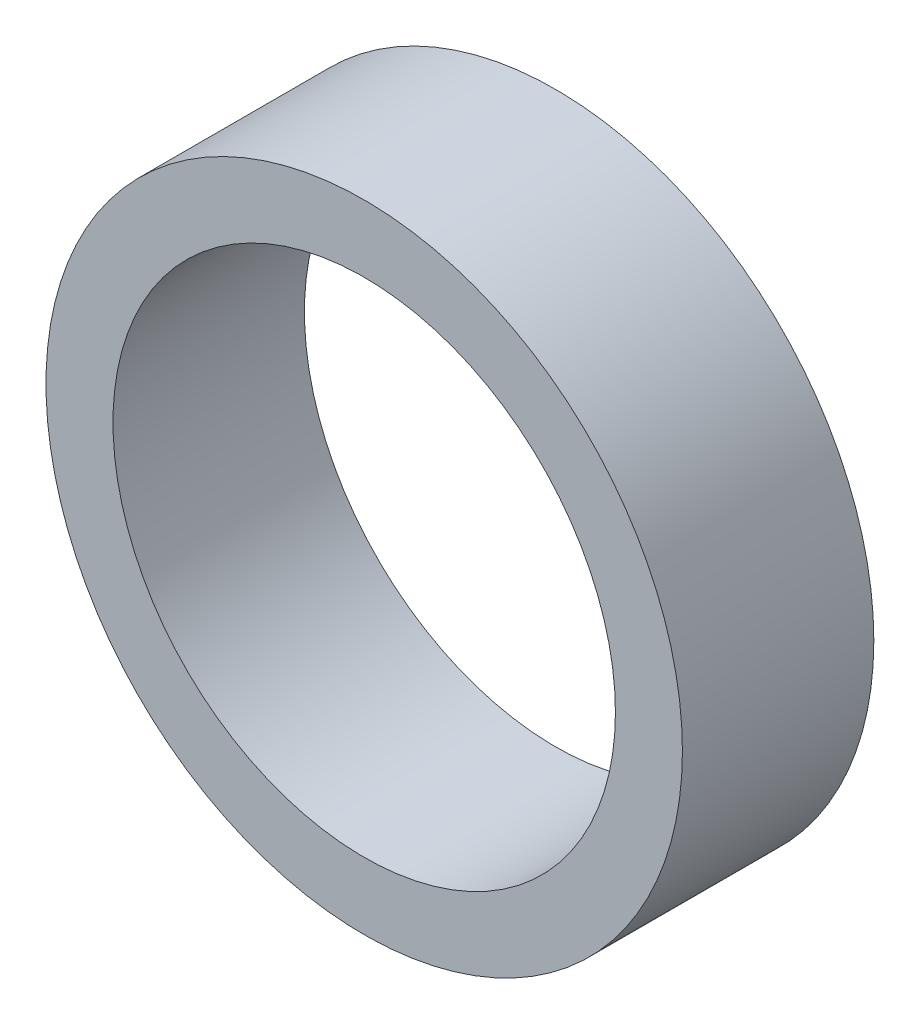
ISO-10303-21;
HEADER;
FILE_DESCRIPTION(('STEP AP214'),'2;1');
FILE_NAME('part.step','',(''),(''),'','','');
FILE_SCHEMA(('AUTOMOTIVE_DESIGN { 1 0 10303 214 1 1 1 1 }'));
ENDSEC;
DATA;
#1=APPLICATION_CONTEXT('core data for automotive mechanical design processes');
#2=APPLICATION_PROTOCOL_DEFINITION('international standard','automotive_design',2000,#1);
#3=PRODUCT_CONTEXT('',#1,'mechanical');
#4=PRODUCT('Part','Part','',(#3));
#5=PRODUCT_RELATED_PRODUCT_CATEGORY('part','',(#4));
#6=PRODUCT_DEFINITION_FORMATION('','',#4);
#7=PRODUCT_DEFINITION_CONTEXT('part definition',#1,'design');
#8=PRODUCT_DEFINITION('design','',#6,#7);
#9=PRODUCT_DEFINITION_SHAPE('','',#8);
#10=(LENGTH_UNIT() NAMED_UNIT(*) SI_UNIT(.MILLI.,.METRE.));
#11=(NAMED_UNIT(*) PLANE_ANGLE_UNIT() SI_UNIT($,.RADIAN.));
#12=(NAMED_UNIT(*) SI_UNIT($,.STERADIAN.) SOLID_ANGLE_UNIT());
#13=UNCERTAINTY_MEASURE_WITH_UNIT(LENGTH_MEASURE(1.E-05),#10,'distance_accuracy_value','');
#14=(GEOMETRIC_REPRESENTATION_CONTEXT(3) GLOBAL_UNCERTAINTY_ASSIGNED_CONTEXT((#13)) GLOBAL_UNIT_ASSIGNED_CONTEXT((#10,
#11,#12)) REPRESENTATION_CONTEXT('',''));
#15=CARTESIAN_POINT('',(0.,0.,0.));
#16=DIRECTION('',(0.,0.,1.));
#17=DIRECTION('',(1.,0.,0.));
#18=AXIS2_PLACEMENT_3D('',#15,#16,#17);
#19=CARTESIAN_POINT('',(32.5,0.,10.));
#20=DIRECTION('',(0.,0.,1.));
#21=DIRECTION('',(1.,0.,0.));
#22=AXIS2_PLACEMENT_3D('',#19,#20,#21);
#23=PLANE('',#22);
#24=CARTESIAN_POINT('',(32.5,0.,10.));
#25=DIRECTION('',(0.,0.,1.));
#26=DIRECTION('',(1.,0.,0.));
#27=AXIS2_PLACEMENT_3D('',#24,#25,#26);
#28=CIRCLE('',#27,3.325);
#29=CARTESIAN_POINT('',(35.825,0.,10.));
#30=VERTEX_POINT('',#29);
#31=EDGE_CURVE('E10',#30,#30,#28,.T.);
#32=ORIENTED_EDGE('',*,*,#31,.T.);
#33=EDGE_LOOP('',(#32));
#34=FACE_BOUND('',#33,.T.);
#35=CARTESIAN_POINT('',(32.5,0.,10.));
#36=DIRECTION('',(0.,0.,1.));
#37=DIRECTION('',(1.,0.,0.));
#38=AXIS2_PLACEMENT_3D('',#35,#36,#37);
#39=CIRCLE('',#38,2.625);
#40=CARTESIAN_POINT('',(35.125,0.,10.));
#41=VERTEX_POINT('',#40);
#42=EDGE_CURVE('E48',#41,#41,#39,.T.);
#43=ORIENTED_EDGE('',*,*,#42,.F.);
#44=EDGE_LOOP('',(#43));
#45=FACE_BOUND('',#44,.T.);
#46=ADVANCED_FACE('F37',(#34,#45),#23,.T.);
#47=CARTESIAN_POINT('',(32.5,0.,8.));
#48=DIRECTION('',(0.,0.,1.));
#49=DIRECTION('',(1.,0.,0.));
#50=AXIS2_PLACEMENT_3D('',#47,#48,#49);
#51=PLANE('',#50);
#52=CARTESIAN_POINT('',(32.5,0.,8.));
#53=DIRECTION('',(0.,0.,1.));
#54=DIRECTION('',(1.,0.,0.));
#55=AXIS2_PLACEMENT_3D('',#52,#53,#54);
#56=CIRCLE('',#55,3.325);
#57=CARTESIAN_POINT('',(35.825,0.,8.));
#58=VERTEX_POINT('',#57);
#59=EDGE_CURVE('E41',#58,#58,#56,.T.);
#60=ORIENTED_EDGE('',*,*,#59,.F.);
#61=EDGE_LOOP('',(#60));
#62=FACE_BOUND('',#61,.T.);
#63=CARTESIAN_POINT('',(32.5,0.,8.));
#64=DIRECTION('',(0.,0.,1.));
#65=DIRECTION('',(1.,0.,0.));
#66=AXIS2_PLACEMENT_3D('',#63,#64,#65);
#67=CIRCLE('',#66,2.625);
#68=CARTESIAN_POINT('',(35.125,0.,8.));
#69=VERTEX_POINT('',#68);
#70=EDGE_CURVE('E50',#69,#69,#67,.T.);
#71=ORIENTED_EDGE('',*,*,#70,.T.);
#72=EDGE_LOOP('',(#71));
#73=FACE_BOUND('',#72,.T.);
#74=ADVANCED_FACE('F60',(#62,#73),#51,.F.);
#75=CARTESIAN_POINT('',(32.5,0.,10.));
#76=DIRECTION('',(0.,0.,-1.));
#77=DIRECTION('',(-1.,0.,0.));
#78=AXIS2_PLACEMENT_3D('',#75,#76,#77);
#79=CYLINDRICAL_SURFACE('',#78,3.325);
#80=ORIENTED_EDGE('',*,*,#31,.F.);
#81=EDGE_LOOP('',(#80));
#82=FACE_BOUND('',#81,.T.);
#83=ORIENTED_EDGE('',*,*,#59,.T.);
#84=EDGE_LOOP('',(#83));
#85=FACE_BOUND('',#84,.T.);
#86=ADVANCED_FACE('F39',(#82,#85),#79,.T.);
#87=CARTESIAN_POINT('',(32.5,0.,10.));
#88=DIRECTION('',(0.,0.,-1.));
#89=DIRECTION('',(-1.,0.,0.));
#90=AXIS2_PLACEMENT_3D('',#87,#88,#89);
#91=CYLINDRICAL_SURFACE('',#90,2.625);
#92=ORIENTED_EDGE('',*,*,#42,.T.);
#93=EDGE_LOOP('',(#92));
#94=FACE_BOUND('',#93,.T.);
#95=ORIENTED_EDGE('',*,*,#70,.F.);
#96=EDGE_LOOP('',(#95));
#97=FACE_BOUND('',#96,.T.);
#98=ADVANCED_FACE('F56',(#94,#97),#91,.F.);
#99=CLOSED_SHELL('',(#46,#74,#86,#98));
#100=MANIFOLD_SOLID_BREP('B2',#99);
#101=ADVANCED_BREP_SHAPE_REPRESENTATION('',(#18,#100),#14);
#102=SHAPE_DEFINITION_REPRESENTATION(#9,#101);
ENDSEC;
END-ISO-10303-21;
